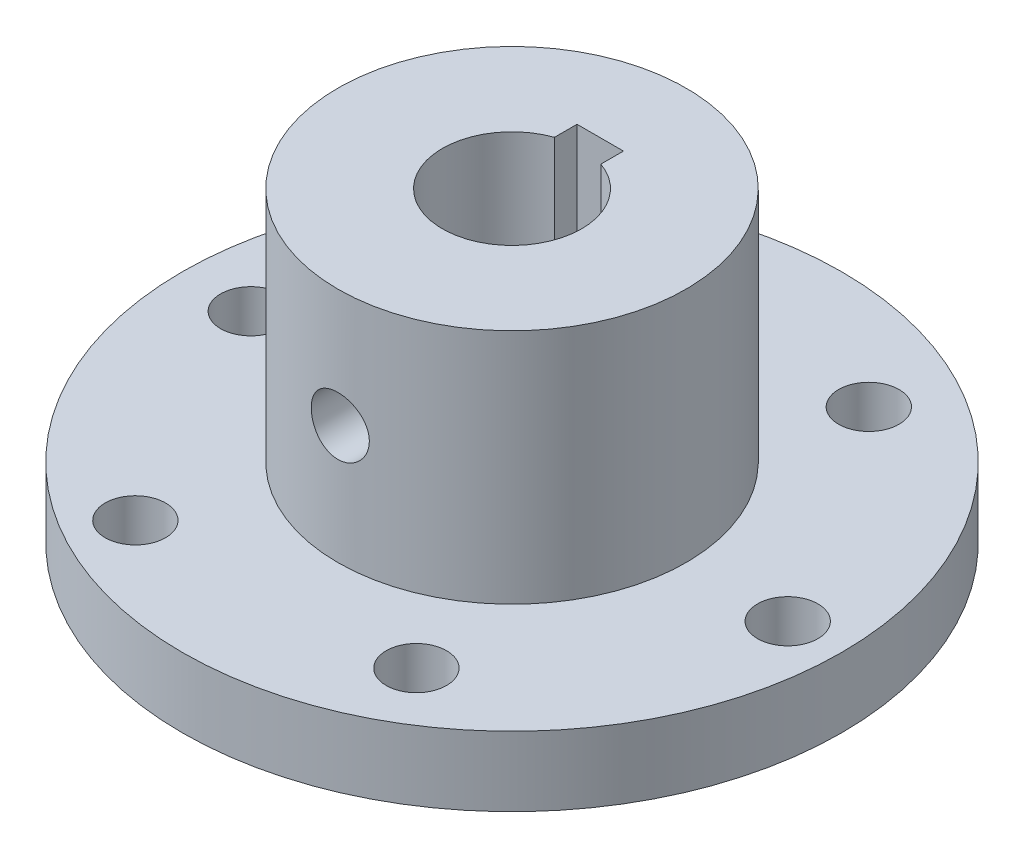
ISO-10303-21;
HEADER;
FILE_DESCRIPTION(('STEP AP214'),'2;1');
FILE_NAME('part.step','',(''),(''),'','','');
FILE_SCHEMA(('AUTOMOTIVE_DESIGN { 1 0 10303 214 1 1 1 1 }'));
ENDSEC;
DATA;
#1=APPLICATION_CONTEXT('core data for automotive mechanical design processes');
#2=APPLICATION_PROTOCOL_DEFINITION('international standard','automotive_design',2000,#1);
#3=PRODUCT_CONTEXT('',#1,'mechanical');
#4=PRODUCT('Part','Part','',(#3));
#5=PRODUCT_RELATED_PRODUCT_CATEGORY('part','',(#4));
#6=PRODUCT_DEFINITION_FORMATION('','',#4);
#7=PRODUCT_DEFINITION_CONTEXT('part definition',#1,'design');
#8=PRODUCT_DEFINITION('design','',#6,#7);
#9=PRODUCT_DEFINITION_SHAPE('','',#8);
#10=(LENGTH_UNIT() NAMED_UNIT(*) SI_UNIT(.MILLI.,.METRE.));
#11=(NAMED_UNIT(*) PLANE_ANGLE_UNIT() SI_UNIT($,.RADIAN.));
#12=(NAMED_UNIT(*) SI_UNIT($,.STERADIAN.) SOLID_ANGLE_UNIT());
#13=UNCERTAINTY_MEASURE_WITH_UNIT(LENGTH_MEASURE(1.E-05),#10,'distance_accuracy_value','');
#14=(GEOMETRIC_REPRESENTATION_CONTEXT(3) GLOBAL_UNCERTAINTY_ASSIGNED_CONTEXT((#13)) GLOBAL_UNIT_ASSIGNED_CONTEXT((#10,
#11,#12)) REPRESENTATION_CONTEXT('',''));
#15=CARTESIAN_POINT('',(0.,0.,0.));
#16=DIRECTION('',(0.,0.,1.));
#17=DIRECTION('',(1.,0.,0.));
#18=AXIS2_PLACEMENT_3D('',#15,#16,#17);
#19=CARTESIAN_POINT('',(0.,21.7671398618388,0.));
#20=DIRECTION('',(0.,1.,0.));
#21=DIRECTION('',(0.,0.,1.));
#22=AXIS2_PLACEMENT_3D('',#19,#20,#21);
#23=CYLINDRICAL_SURFACE('',#22,6.);
#24=CARTESIAN_POINT('',(2.49999999999999,16.2,5.45435605731786));
#25=CARTESIAN_POINT('',(2.4999985002592,16.2667081831549,5.45435734054166));
#26=CARTESIAN_POINT('',(2.49732449538892,16.3334347921685,5.4555854329));
#27=CARTESIAN_POINT('',(2.48666416485592,16.466386478403,5.460451257595));
#28=CARTESIAN_POINT('',(2.47867468210214,16.5326112338951,5.46409042196574));
#29=CARTESIAN_POINT('',(2.44679265931591,16.7300518667706,5.47848490817198));
#30=CARTESIAN_POINT('',(2.41498683408237,16.8598368164295,5.49271671920564));
#31=CARTESIAN_POINT('',(2.33180001337598,17.1111547641312,5.52853615769555));
#32=CARTESIAN_POINT('',(2.28049881438597,17.2327190520916,5.55009376241033));
#33=CARTESIAN_POINT('',(2.16001268934737,17.465510176557,5.59808356001864));
#34=CARTESIAN_POINT('',(2.09083199376536,17.5767394499768,5.62451459938574));
#35=CARTESIAN_POINT('',(1.93194778443699,17.7926539820894,5.68111508149861));
#36=CARTESIAN_POINT('',(1.84130648149063,17.8966157970475,5.71141131571832));
#37=CARTESIAN_POINT('',(1.64404334636732,18.0883997651745,5.77128595332676));
#38=CARTESIAN_POINT('',(1.53741538134828,18.1762156955111,5.80086407614999));
#39=CARTESIAN_POINT('',(1.30552678905513,18.3368992555286,5.8575107455344));
#40=CARTESIAN_POINT('',(1.17965858775786,18.4089533078815,5.88441479600861));
#41=CARTESIAN_POINT('',(0.916264044334339,18.5305519892175,5.93113040336416));
#42=CARTESIAN_POINT('',(0.778742909642265,18.5801066103974,5.95094510785638));
#43=CARTESIAN_POINT('',(0.503536996147009,18.6526789303404,5.98035041998161));
#44=CARTESIAN_POINT('',(0.366233152418011,18.6769433932332,5.99041942231785));
#45=CARTESIAN_POINT('',(0.0891583607041755,18.702275278892,6.00093657245546));
#46=CARTESIAN_POINT('',(-0.0506115635357642,18.7033521108742,6.00138862268061));
#47=CARTESIAN_POINT('',(-0.319585560218811,18.6829314389708,5.99290258260449));
#48=CARTESIAN_POINT('',(-0.44891497721289,18.6628037991731,5.98453429295767));
#49=CARTESIAN_POINT('',(-0.702165787864644,18.6028937944991,5.96013033502178));
#50=CARTESIAN_POINT('',(-0.826086782110444,18.5631099806788,5.94409410149731));
#51=CARTESIAN_POINT('',(-1.06727623615442,18.4645439182725,5.90559704827471));
#52=CARTESIAN_POINT('',(-1.18441435414908,18.4054810742758,5.88304194251414));
#53=CARTESIAN_POINT('',(-1.40742353456465,18.2703084865819,5.83371427980366));
#54=CARTESIAN_POINT('',(-1.51329059551623,18.1941927183021,5.80694023334947));
#55=CARTESIAN_POINT('',(-1.7186818234134,18.0208351591992,5.74963397551512));
#56=CARTESIAN_POINT('',(-1.81723287462318,17.922482417457,5.71896988702082));
#57=CARTESIAN_POINT('',(-1.99686282986463,17.7105771185719,5.65875721372882));
#58=CARTESIAN_POINT('',(-2.07793499168339,17.5970187233643,5.62920906299902));
#59=CARTESIAN_POINT('',(-2.22280378497074,17.3532099267203,5.57363224672088));
#60=CARTESIAN_POINT('',(-2.28594506698396,17.2225335886945,5.54775116967603));
#61=CARTESIAN_POINT('',(-2.38892864103959,16.9510379102374,5.50419688296718));
#62=CARTESIAN_POINT('',(-2.42878759251237,16.8102259035157,5.48651780631503));
#63=CARTESIAN_POINT('',(-2.48160050339177,16.532206382133,5.46282425074792));
#64=CARTESIAN_POINT('',(-2.49613229266516,16.3953577554715,5.45612738403682));
#65=CARTESIAN_POINT('',(-2.50251261037212,16.1210430351874,5.45320573611839));
#66=CARTESIAN_POINT('',(-2.49436898636094,15.9835771716193,5.45697733196185));
#67=CARTESIAN_POINT('',(-2.45706955131302,15.7212032291366,5.47386262693795));
#68=CARTESIAN_POINT('',(-2.42929237636147,15.5960546264258,5.48636276033852));
#69=CARTESIAN_POINT('',(-2.355341171284,15.3522974070049,5.51851260594277));
#70=CARTESIAN_POINT('',(-2.30916284106237,15.2336903263384,5.53816398920152));
#71=CARTESIAN_POINT('',(-2.19755041610386,15.0007693792872,5.58341595714177));
#72=CARTESIAN_POINT('',(-2.13138366612392,14.8868500507806,5.60923324404617));
#73=CARTESIAN_POINT('',(-1.98240156877197,14.6711838950007,5.66360007481535));
#74=CARTESIAN_POINT('',(-1.89957901575222,14.5694423665913,5.69215079841133));
#75=CARTESIAN_POINT('',(-1.71168891143074,14.3723997302374,5.75157239569101));
#76=CARTESIAN_POINT('',(-1.6053593229584,14.2782972001197,5.78244293417774));
#77=CARTESIAN_POINT('',(-1.37770302510815,14.1090554160204,5.84086722367755));
#78=CARTESIAN_POINT('',(-1.25637521761135,14.0339175517941,5.86842073153699));
#79=CARTESIAN_POINT('',(-1.00130936160272,13.9048202491916,5.91728503171628));
#80=CARTESIAN_POINT('',(-0.867540339261894,13.8509155177152,5.93857966278875));
#81=CARTESIAN_POINT('',(-0.591717670323945,13.7667664150372,5.9723634620551));
#82=CARTESIAN_POINT('',(-0.449669008506774,13.736507962451,5.98485787035281));
#83=CARTESIAN_POINT('',(-0.172033066960382,13.7022837499796,5.9990306959926));
#84=CARTESIAN_POINT('',(-0.036688169398434,13.69662800429,6.0014040908376));
#85=CARTESIAN_POINT('',(0.232973623239238,13.7072262789047,5.99699046946599));
#86=CARTESIAN_POINT('',(0.367290694377476,13.723476458314,5.99020505911644));
#87=CARTESIAN_POINT('',(0.626172965578195,13.7762121575427,5.96860132018429));
#88=CARTESIAN_POINT('',(0.750915078182083,13.8119594094758,5.9540764862017));
#89=CARTESIAN_POINT('',(0.992584458507235,13.9018684458724,5.91858999492374));
#90=CARTESIAN_POINT('',(1.1095102366691,13.9560337283582,5.89762711496349));
#91=CARTESIAN_POINT('',(1.33804914068053,14.0839792475792,5.85011651583377));
#92=CARTESIAN_POINT('',(1.44918335299798,14.1585353235131,5.82335921372399));
#93=CARTESIAN_POINT('',(1.65783731421916,14.3240136448107,5.7674312075248));
#94=CARTESIAN_POINT('',(1.75535198504112,14.4149419658361,5.73825960968076));
#95=CARTESIAN_POINT('',(1.94089972242289,14.6178925300721,5.67829702479813));
#96=CARTESIAN_POINT('',(2.02783607699355,14.73092911203,5.64753091772368));
#97=CARTESIAN_POINT('',(2.18166607575475,14.9709063920007,5.5899105903639));
#98=CARTESIAN_POINT('',(2.24854851583745,15.0978548086674,5.56305856115973));
#99=CARTESIAN_POINT('',(2.35965744264202,15.3619289333595,5.51685287460303));
#100=CARTESIAN_POINT('',(2.40400437258695,15.4989959551496,5.49745949216625));
#101=CARTESIAN_POINT('',(2.45239925350777,15.7091637690664,5.47594959049764));
#102=CARTESIAN_POINT('',(2.46550603347807,15.779910597956,5.47004503557757));
#103=CARTESIAN_POINT('',(2.48558130943927,15.9224260564186,5.46095373466209));
#104=CARTESIAN_POINT('',(2.49255414024396,15.9941939279226,5.45776506941946));
#105=CARTESIAN_POINT('',(2.49880479670822,16.110711605639,5.45490391727668));
#106=CARTESIAN_POINT('',(2.50000100378858,16.1553516756734,5.45435519844583));
#107=CARTESIAN_POINT('',(2.49999999999999,16.2,5.45435605731786));
#108=B_SPLINE_CURVE_WITH_KNOTS('',3,(#24,#25,#26,#27,#28,#29,#30,#31,#32,#33,#34,#35,#36,#37,
#38,#39,#40,#41,#42,#43,#44,#45,#46,#47,#48,#49,#50,#51,#52,#53,#54,#55,#56,#57,#58,#59,#60,#61,
#62,#63,#64,#65,#66,#67,#68,#69,#70,#71,#72,#73,#74,#75,#76,#77,#78,#79,#80,#81,#82,#83,#84,#85,
#86,#87,#88,#89,#90,#91,#92,#93,#94,#95,#96,#97,#98,#99,#100,#101,#102,#103,#104,#105,#106,
#107),.UNSPECIFIED.,.T.,.F.,(4,2,2,2,2,2,2,2,2,2,2,2,2,2,2,2,2,2,2,2,2,2,2,2,2,2,2,2,2,2,2,2,2,
2,2,2,2,2,2,2,2,4),(0.,0.200084575093045,0.400288095243579,0.8012789949569,1.20064597557677,
1.59991854837274,2.02172149988562,2.44368668047075,2.88395420283102,3.32402600677036,
3.74119679083158,4.15819828963115,4.5498214761744,4.94147353531021,5.33910096407385,
5.73686909172222,6.16267530816222,6.58864548009986,7.02861558463917,7.46827048625632,
7.87940023747109,8.29038772171391,8.67506269266877,9.05982760961553,9.46088720770831,
9.86212068725424,10.2960179260552,10.7299469521823,11.1649867904568,11.5997673642051,
12.004157373226,12.4084764873832,12.7984529720747,13.1885035639884,13.5961819279257,
14.004011892323,14.4395932095167,14.8754174341574,15.3088871873109,15.5252058174741,
15.7413714538654,15.8752896716762),.UNSPECIFIED.);
#109=CARTESIAN_POINT('',(2.49999999999999,16.2,5.45435605731786));
#110=VERTEX_POINT('',#109);
#111=EDGE_CURVE('E189',#110,#110,#108,.T.);
#112=ORIENTED_EDGE('',*,*,#111,.T.);
#113=EDGE_LOOP('',(#112));
#114=FACE_BOUND('',#113,.T.);
#115=CARTESIAN_POINT('',(0.,0.,0.));
#116=DIRECTION('',(0.,1.,0.));
#117=DIRECTION('',(0.,0.,1.));
#118=AXIS2_PLACEMENT_3D('',#115,#116,#117);
#119=CIRCLE('',#118,6.);
#120=CARTESIAN_POINT('',(-2.,0.,-5.65685424949238));
#121=VERTEX_POINT('',#120);
#122=CARTESIAN_POINT('',(2.,0.,-5.65685424949238));
#123=VERTEX_POINT('',#122);
#124=EDGE_CURVE('E11',#121,#123,#119,.T.);
#125=ORIENTED_EDGE('',*,*,#124,.F.);
#126=DIRECTION('',(0.,1.,0.));
#127=VECTOR('',#126,1.);
#128=CARTESIAN_POINT('',(-2.,-0.001000000000001,-5.65685424949238));
#129=LINE('',#128,#127);
#130=CARTESIAN_POINT('',(-2.,26.4,-5.65685424949238));
#131=VERTEX_POINT('',#130);
#132=EDGE_CURVE('E60',#121,#131,#129,.T.);
#133=ORIENTED_EDGE('',*,*,#132,.T.);
#134=CARTESIAN_POINT('',(0.,26.4,0.));
#135=DIRECTION('',(0.,1.,0.));
#136=DIRECTION('',(0.,0.,1.));
#137=AXIS2_PLACEMENT_3D('',#134,#135,#136);
#138=CIRCLE('',#137,6.);
#139=CARTESIAN_POINT('',(2.,26.4,-5.65685424949238));
#140=VERTEX_POINT('',#139);
#141=EDGE_CURVE('E90',#131,#140,#138,.T.);
#142=ORIENTED_EDGE('',*,*,#141,.T.);
#143=DIRECTION('',(0.,1.,0.));
#144=VECTOR('',#143,1.);
#145=CARTESIAN_POINT('',(2.,-0.001000000000001,-5.65685424949238));
#146=LINE('',#145,#144);
#147=EDGE_CURVE('E52',#123,#140,#146,.T.);
#148=ORIENTED_EDGE('',*,*,#147,.F.);
#149=EDGE_LOOP('',(#125,#133,#142,#148));
#150=FACE_BOUND('',#149,.T.);
#151=ADVANCED_FACE('F38',(#114,#150),#23,.F.);
#152=CARTESIAN_POINT('',(0.,0.,-6.));
#153=DIRECTION('',(0.,1.,0.));
#154=DIRECTION('',(0.,0.,1.));
#155=AXIS2_PLACEMENT_3D('',#152,#153,#154);
#156=PLANE('',#155);
#157=CARTESIAN_POINT('',(-22.5,0.,0.));
#158=DIRECTION('',(0.,1.,0.));
#159=DIRECTION('',(0.,0.,1.));
#160=AXIS2_PLACEMENT_3D('',#157,#158,#159);
#161=CIRCLE('',#160,2.6);
#162=CARTESIAN_POINT('',(-22.5,0.,2.6));
#163=VERTEX_POINT('',#162);
#164=EDGE_CURVE('E114',#163,#163,#161,.F.);
#165=ORIENTED_EDGE('',*,*,#164,.F.);
#166=EDGE_LOOP('',(#165));
#167=FACE_BOUND('',#166,.T.);
#168=CARTESIAN_POINT('',(-11.8749999999998,0.,-20.5681033398805));
#169=DIRECTION('',(0.,1.,0.));
#170=DIRECTION('',(0.,0.,1.));
#171=AXIS2_PLACEMENT_3D('',#168,#169,#170);
#172=CIRCLE('',#171,2.6);
#173=CARTESIAN_POINT('',(-11.8749999999998,0.,-17.9681033398805));
#174=VERTEX_POINT('',#173);
#175=EDGE_CURVE('E120',#174,#174,#172,.F.);
#176=ORIENTED_EDGE('',*,*,#175,.F.);
#177=EDGE_LOOP('',(#176));
#178=FACE_BOUND('',#177,.T.);
#179=CARTESIAN_POINT('',(-11.8750000000001,0.,20.5681033398804));
#180=DIRECTION('',(0.,1.,0.));
#181=DIRECTION('',(0.,0.,1.));
#182=AXIS2_PLACEMENT_3D('',#179,#180,#181);
#183=CIRCLE('',#182,2.6);
#184=CARTESIAN_POINT('',(-11.8750000000001,0.,23.1681033398804));
#185=VERTEX_POINT('',#184);
#186=EDGE_CURVE('E139',#185,#185,#183,.F.);
#187=ORIENTED_EDGE('',*,*,#186,.F.);
#188=EDGE_LOOP('',(#187));
#189=FACE_BOUND('',#188,.T.);
#190=CARTESIAN_POINT('',(11.2499999999998,0.,19.48557158515));
#191=DIRECTION('',(0.,1.,0.));
#192=DIRECTION('',(0.,0.,1.));
#193=AXIS2_PLACEMENT_3D('',#190,#191,#192);
#194=CIRCLE('',#193,2.6);
#195=CARTESIAN_POINT('',(11.2499999999998,0.,22.08557158515));
#196=VERTEX_POINT('',#195);
#197=EDGE_CURVE('E133',#196,#196,#194,.F.);
#198=ORIENTED_EDGE('',*,*,#197,.F.);
#199=EDGE_LOOP('',(#198));
#200=FACE_BOUND('',#199,.T.);
#201=CARTESIAN_POINT('',(11.2500000000001,0.,-19.4855715851498));
#202=DIRECTION('',(0.,1.,0.));
#203=DIRECTION('',(0.,0.,1.));
#204=AXIS2_PLACEMENT_3D('',#201,#202,#203);
#205=CIRCLE('',#204,2.6);
#206=CARTESIAN_POINT('',(11.2500000000001,0.,-16.8855715851498));
#207=VERTEX_POINT('',#206);
#208=EDGE_CURVE('E127',#207,#207,#205,.F.);
#209=ORIENTED_EDGE('',*,*,#208,.F.);
#210=EDGE_LOOP('',(#209));
#211=FACE_BOUND('',#210,.T.);
#212=CARTESIAN_POINT('',(23.75,0.,0.));
#213=DIRECTION('',(0.,1.,0.));
#214=DIRECTION('',(0.,0.,1.));
#215=AXIS2_PLACEMENT_3D('',#212,#213,#214);
#216=CIRCLE('',#215,2.6);
#217=CARTESIAN_POINT('',(23.75,0.,2.6));
#218=VERTEX_POINT('',#217);
#219=EDGE_CURVE('E115',#218,#218,#216,.F.);
#220=ORIENTED_EDGE('',*,*,#219,.F.);
#221=EDGE_LOOP('',(#220));
#222=FACE_BOUND('',#221,.T.);
#223=CARTESIAN_POINT('',(0.,0.,0.));
#224=DIRECTION('',(0.,1.,0.));
#225=DIRECTION('',(0.,0.,1.));
#226=AXIS2_PLACEMENT_3D('',#223,#224,#225);
#227=CIRCLE('',#226,28.4);
#228=CARTESIAN_POINT('',(0.,0.,28.4));
#229=VERTEX_POINT('',#228);
#230=EDGE_CURVE('E45',#229,#229,#227,.T.);
#231=ORIENTED_EDGE('',*,*,#230,.F.);
#232=EDGE_LOOP('',(#231));
#233=FACE_BOUND('',#232,.T.);
#234=DIRECTION('',(1.,0.,0.));
#235=VECTOR('',#234,1.);
#236=CARTESIAN_POINT('',(-2.,0.,-7.6));
#237=LINE('',#236,#235);
#238=CARTESIAN_POINT('',(-2.,0.,-7.6));
#239=VERTEX_POINT('',#238);
#240=CARTESIAN_POINT('',(2.,0.,-7.6));
#241=VERTEX_POINT('',#240);
#242=EDGE_CURVE('E95',#239,#241,#237,.T.);
#243=ORIENTED_EDGE('',*,*,#242,.F.);
#244=DIRECTION('',(0.,0.,-1.));
#245=VECTOR('',#244,1.);
#246=CARTESIAN_POINT('',(-2.,0.,-7.6));
#247=LINE('',#246,#245);
#248=EDGE_CURVE('E94',#121,#239,#247,.T.);
#249=ORIENTED_EDGE('',*,*,#248,.F.);
#250=ORIENTED_EDGE('',*,*,#124,.T.);
#251=DIRECTION('',(0.,0.,1.));
#252=VECTOR('',#251,1.);
#253=CARTESIAN_POINT('',(2.,0.,-7.6));
#254=LINE('',#253,#252);
#255=EDGE_CURVE('E78',#241,#123,#254,.T.);
#256=ORIENTED_EDGE('',*,*,#255,.F.);
#257=EDGE_LOOP('',(#243,#249,#250,#256));
#258=FACE_BOUND('',#257,.T.);
#259=ADVANCED_FACE('F93',(#167,#178,#189,#200,#211,#222,#233,#258),#156,.F.);
#260=CARTESIAN_POINT('',(0.,21.7671398618388,0.));
#261=DIRECTION('',(0.,1.,0.));
#262=DIRECTION('',(0.,0.,1.));
#263=AXIS2_PLACEMENT_3D('',#260,#261,#262);
#264=CYLINDRICAL_SURFACE('',#263,28.4);
#265=CARTESIAN_POINT('',(0.,6.,0.));
#266=DIRECTION('',(0.,1.,0.));
#267=DIRECTION('',(0.,0.,1.));
#268=AXIS2_PLACEMENT_3D('',#265,#266,#267);
#269=CIRCLE('',#268,28.4);
#270=CARTESIAN_POINT('',(0.,6.,28.4));
#271=VERTEX_POINT('',#270);
#272=EDGE_CURVE('E153',#271,#271,#269,.T.);
#273=ORIENTED_EDGE('',*,*,#272,.F.);
#274=EDGE_LOOP('',(#273));
#275=FACE_BOUND('',#274,.T.);
#276=ORIENTED_EDGE('',*,*,#230,.T.);
#277=EDGE_LOOP('',(#276));
#278=FACE_BOUND('',#277,.T.);
#279=ADVANCED_FACE('F158',(#275,#278),#264,.T.);
#280=CARTESIAN_POINT('',(0.,6.,-28.4));
#281=DIRECTION('',(0.,-1.,0.));
#282=DIRECTION('',(0.,0.,-1.));
#283=AXIS2_PLACEMENT_3D('',#280,#281,#282);
#284=PLANE('',#283);
#285=CARTESIAN_POINT('',(-22.5,6.,0.));
#286=DIRECTION('',(0.,1.,0.));
#287=DIRECTION('',(0.,0.,1.));
#288=AXIS2_PLACEMENT_3D('',#285,#286,#287);
#289=CIRCLE('',#288,2.6);
#290=CARTESIAN_POINT('',(-22.5,6.,2.6));
#291=VERTEX_POINT('',#290);
#292=EDGE_CURVE('E111',#291,#291,#289,.T.);
#293=ORIENTED_EDGE('',*,*,#292,.F.);
#294=EDGE_LOOP('',(#293));
#295=FACE_BOUND('',#294,.T.);
#296=CARTESIAN_POINT('',(-11.8749999999998,6.,-20.5681033398805));
#297=DIRECTION('',(0.,1.,0.));
#298=DIRECTION('',(0.,0.,1.));
#299=AXIS2_PLACEMENT_3D('',#296,#297,#298);
#300=CIRCLE('',#299,2.6);
#301=CARTESIAN_POINT('',(-11.8749999999998,6.,-17.9681033398805));
#302=VERTEX_POINT('',#301);
#303=EDGE_CURVE('E84',#302,#302,#300,.T.);
#304=ORIENTED_EDGE('',*,*,#303,.F.);
#305=EDGE_LOOP('',(#304));
#306=FACE_BOUND('',#305,.T.);
#307=CARTESIAN_POINT('',(-11.8750000000001,6.,20.5681033398804));
#308=DIRECTION('',(0.,1.,0.));
#309=DIRECTION('',(0.,0.,1.));
#310=AXIS2_PLACEMENT_3D('',#307,#308,#309);
#311=CIRCLE('',#310,2.6);
#312=CARTESIAN_POINT('',(-11.8750000000001,6.,23.1681033398804));
#313=VERTEX_POINT('',#312);
#314=EDGE_CURVE('E123',#313,#313,#311,.T.);
#315=ORIENTED_EDGE('',*,*,#314,.F.);
#316=EDGE_LOOP('',(#315));
#317=FACE_BOUND('',#316,.T.);
#318=CARTESIAN_POINT('',(11.2499999999998,6.,19.48557158515));
#319=DIRECTION('',(0.,1.,0.));
#320=DIRECTION('',(0.,0.,1.));
#321=AXIS2_PLACEMENT_3D('',#318,#319,#320);
#322=CIRCLE('',#321,2.6);
#323=CARTESIAN_POINT('',(11.2499999999998,6.,22.08557158515));
#324=VERTEX_POINT('',#323);
#325=EDGE_CURVE('E136',#324,#324,#322,.T.);
#326=ORIENTED_EDGE('',*,*,#325,.F.);
#327=EDGE_LOOP('',(#326));
#328=FACE_BOUND('',#327,.T.);
#329=CARTESIAN_POINT('',(11.2500000000001,6.,-19.4855715851498));
#330=DIRECTION('',(0.,1.,0.));
#331=DIRECTION('',(0.,0.,1.));
#332=AXIS2_PLACEMENT_3D('',#329,#330,#331);
#333=CIRCLE('',#332,2.6);
#334=CARTESIAN_POINT('',(11.2500000000001,6.,-16.8855715851498));
#335=VERTEX_POINT('',#334);
#336=EDGE_CURVE('E130',#335,#335,#333,.T.);
#337=ORIENTED_EDGE('',*,*,#336,.F.);
#338=EDGE_LOOP('',(#337));
#339=FACE_BOUND('',#338,.T.);
#340=CARTESIAN_POINT('',(23.75,6.,0.));
#341=DIRECTION('',(0.,1.,0.));
#342=DIRECTION('',(0.,0.,1.));
#343=AXIS2_PLACEMENT_3D('',#340,#341,#342);
#344=CIRCLE('',#343,2.6);
#345=CARTESIAN_POINT('',(23.75,6.,2.6));
#346=VERTEX_POINT('',#345);
#347=EDGE_CURVE('E124',#346,#346,#344,.T.);
#348=ORIENTED_EDGE('',*,*,#347,.F.);
#349=EDGE_LOOP('',(#348));
#350=FACE_BOUND('',#349,.T.);
#351=CARTESIAN_POINT('',(0.,6.,0.));
#352=DIRECTION('',(0.,1.,0.));
#353=DIRECTION('',(0.,0.,1.));
#354=AXIS2_PLACEMENT_3D('',#351,#352,#353);
#355=CIRCLE('',#354,15.);
#356=CARTESIAN_POINT('',(0.,6.,15.));
#357=VERTEX_POINT('',#356);
#358=EDGE_CURVE('E150',#357,#357,#355,.T.);
#359=ORIENTED_EDGE('',*,*,#358,.F.);
#360=EDGE_LOOP('',(#359));
#361=FACE_BOUND('',#360,.T.);
#362=ORIENTED_EDGE('',*,*,#272,.T.);
#363=EDGE_LOOP('',(#362));
#364=FACE_BOUND('',#363,.T.);
#365=ADVANCED_FACE('F166',(#295,#306,#317,#328,#339,#350,#361,#364),#284,.F.);
#366=CARTESIAN_POINT('',(0.,21.7671398618388,0.));
#367=DIRECTION('',(0.,1.,0.));
#368=DIRECTION('',(0.,0.,1.));
#369=AXIS2_PLACEMENT_3D('',#366,#367,#368);
#370=CYLINDRICAL_SURFACE('',#369,15.);
#371=CARTESIAN_POINT('',(0.,13.7,15.));
#372=CARTESIAN_POINT('',(-0.139390904958214,13.7000055889478,14.9999976116882));
#373=CARTESIAN_POINT('',(-0.27885788183882,13.7116972749689,14.9980367791303));
#374=CARTESIAN_POINT('',(-0.553880221673041,13.7581356587653,14.9904034494139));
#375=CARTESIAN_POINT('',(-0.689431867959245,13.7929035569116,14.9847275392389));
#376=CARTESIAN_POINT('',(-0.952604747212641,13.8844154485928,14.9703006823645));
#377=CARTESIAN_POINT('',(-1.0802323684319,13.9411414656406,14.9615522515919));
#378=CARTESIAN_POINT('',(-1.32414184197794,14.0749122920524,14.9419422708207));
#379=CARTESIAN_POINT('',(-1.44042498987859,14.151954777483,14.9310809625443));
#380=CARTESIAN_POINT('',(-1.65947261429167,14.3249550838205,14.9083331745831));
#381=CARTESIAN_POINT('',(-1.76211290353496,14.4210691146361,14.8964387181486));
#382=CARTESIAN_POINT('',(-1.94988849865992,14.6291479684728,14.8730262687673));
#383=CARTESIAN_POINT('',(-2.03502269939097,14.7411137914566,14.8615082996267));
#384=CARTESIAN_POINT('',(-2.18586712560513,14.9785709661971,14.8400756575978));
#385=CARTESIAN_POINT('',(-2.251454552861,15.1041413368048,14.8301712909164));
#386=CARTESIAN_POINT('',(-2.36055836541121,15.3647095643006,14.8131978979467));
#387=CARTESIAN_POINT('',(-2.40407624156561,15.4997067836776,14.8061286801431));
#388=CARTESIAN_POINT('',(-2.4674143777848,15.7739802748565,14.7957053684276));
#389=CARTESIAN_POINT('',(-2.48744902913539,15.9132057365014,14.792317684857));
#390=CARTESIAN_POINT('',(-2.50391672528987,16.1930802768835,14.7895393893665));
#391=CARTESIAN_POINT('',(-2.50035144038899,16.3337292541673,14.7901484945721));
#392=CARTESIAN_POINT('',(-2.46989509839614,16.6109278612754,14.7952642886356));
#393=CARTESIAN_POINT('',(-2.44324488188977,16.7475048035452,14.7997307331892));
#394=CARTESIAN_POINT('',(-2.36775314040344,17.0142213178291,14.8119949521101));
#395=CARTESIAN_POINT('',(-2.31891085431973,17.1443606688885,14.8197928407327));
#396=CARTESIAN_POINT('',(-2.20017724609391,17.3952288234409,14.837884793341));
#397=CARTESIAN_POINT('',(-2.13018591387971,17.5159094060812,14.8481906710733));
#398=CARTESIAN_POINT('',(-1.97121201755743,17.7439044005384,14.8701291841501));
#399=CARTESIAN_POINT('',(-1.88222792065428,17.8512177324549,14.8817619265429));
#400=CARTESIAN_POINT('',(-1.68648221215905,18.0508260858073,14.9052202787979));
#401=CARTESIAN_POINT('',(-1.57951396387312,18.1429185185401,14.9170464923165));
#402=CARTESIAN_POINT('',(-1.35153524898164,18.3078777626653,14.9394260139672));
#403=CARTESIAN_POINT('',(-1.23052469190642,18.3807444501832,14.9499793138975));
#404=CARTESIAN_POINT('',(-0.977705916166708,18.5052022271363,14.9686389289291));
#405=CARTESIAN_POINT('',(-0.845888725564658,18.5567754193312,14.9767431840745));
#406=CARTESIAN_POINT('',(-0.575298345602729,18.636994215246,14.9895750301266));
#407=CARTESIAN_POINT('',(-0.436525739179466,18.6656417369737,14.9943029035047));
#408=CARTESIAN_POINT('',(-0.157709901301622,18.6989213584611,14.9998112984269));
#409=CARTESIAN_POINT('',(-0.0177007371510106,18.7038315718056,15.0006375301278));
#410=CARTESIAN_POINT('',(0.261139772889887,18.6902386555719,14.9983747442117));
#411=CARTESIAN_POINT('',(0.399971163892038,18.6717364268663,14.9952858772412));
#412=CARTESIAN_POINT('',(0.671656175546762,18.6120751506645,14.985568269382));
#413=CARTESIAN_POINT('',(0.804540868385378,18.5710537916099,14.9789610480131));
#414=CARTESIAN_POINT('',(1.06154688486044,18.4676654818005,14.9629446445536));
#415=CARTESIAN_POINT('',(1.18566771590972,18.4052973323647,14.9535353051202));
#416=CARTESIAN_POINT('',(1.42283068946895,18.2603488753032,14.9328451630241));
#417=CARTESIAN_POINT('',(1.53576525093714,18.1775948438327,14.9215485588702));
#418=CARTESIAN_POINT('',(1.74624358550268,17.9944626846149,14.898384673919));
#419=CARTESIAN_POINT('',(1.84378623969658,17.8940832767233,14.8865173517155));
#420=CARTESIAN_POINT('',(2.02174277965799,17.6773024519286,14.8634017523585));
#421=CARTESIAN_POINT('',(2.10196876111371,17.5607458344856,14.8521611613711));
#422=CARTESIAN_POINT('',(2.24170231029498,17.3156470308615,14.8317152977788));
#423=CARTESIAN_POINT('',(2.30121053476982,17.1871052247725,14.8225099606602));
#424=CARTESIAN_POINT('',(2.39753833147314,16.9222102671879,14.807234536977));
#425=CARTESIAN_POINT('',(2.43445143254794,16.7858919049695,14.8011515431106));
#426=CARTESIAN_POINT('',(2.48483545377827,16.5088798707782,14.7927771683526));
#427=CARTESIAN_POINT('',(2.49830841194616,16.3681865802679,14.7904854578272));
#428=CARTESIAN_POINT('',(2.50137286604735,16.0882948340376,14.7899673308401));
#429=CARTESIAN_POINT('',(2.49126013612518,15.9490996214247,14.7916905650565));
#430=CARTESIAN_POINT('',(2.44807983895684,15.6744207519492,14.7988978145373));
#431=CARTESIAN_POINT('',(2.41501234611247,15.5389370830581,14.8043818176121));
#432=CARTESIAN_POINT('',(2.32697448959489,15.2756415627074,14.8184735628172));
#433=CARTESIAN_POINT('',(2.27202959060044,15.147820989944,14.8270776721967));
#434=CARTESIAN_POINT('',(2.1418270039159,14.9031643308052,14.8464436892221));
#435=CARTESIAN_POINT('',(2.06656830874856,14.7863287896279,14.857205703884));
#436=CARTESIAN_POINT('',(1.89681888437215,14.5654644168923,14.8798345404562));
#437=CARTESIAN_POINT('',(1.80211056359364,14.4616039832997,14.891712955763));
#438=CARTESIAN_POINT('',(1.59660903138023,14.2711483955251,14.9151437236084));
#439=CARTESIAN_POINT('',(1.48581211291263,14.1845572313618,14.9266960002655));
#440=CARTESIAN_POINT('',(1.25036916964028,14.0305517318001,14.9482652964222));
#441=CARTESIAN_POINT('',(1.12563278753281,13.9632739606871,14.958271162531));
#442=CARTESIAN_POINT('',(0.866513069378979,13.8507305153901,14.9755116760178));
#443=CARTESIAN_POINT('',(0.732139494830008,13.8054429189203,14.9827490817748));
#444=CARTESIAN_POINT('',(0.497703310045399,13.7479947258733,14.9920579083296));
#445=CARTESIAN_POINT('',(0.399058830298446,13.730025530384,14.9950202727336));
#446=CARTESIAN_POINT('',(0.200289310319809,13.7060262621553,14.9989921598612));
#447=CARTESIAN_POINT('',(0.100164295608494,13.6999959838626,15.0000017162064));
#448=CARTESIAN_POINT('',(0.,13.7,15.));
#449=B_SPLINE_CURVE_WITH_KNOTS('',3,(#371,#372,#373,#374,#375,#376,#377,#378,#379,#380,#381,
#382,#383,#384,#385,#386,#387,#388,#389,#390,#391,#392,#393,#394,#395,#396,#397,#398,#399,#400,
#401,#402,#403,#404,#405,#406,#407,#408,#409,#410,#411,#412,#413,#414,#415,#416,#417,#418,#419,
#420,#421,#422,#423,#424,#425,#426,#427,#428,#429,#430,#431,#432,#433,#434,#435,#436,#437,#438,
#439,#440,#441,#442,#443,#444,#445,#446,#447,#448),.UNSPECIFIED.,.T.,.F.,(4,2,2,2,2,2,2,2,2,2,2,
2,2,2,2,2,2,2,2,2,2,2,2,2,2,2,2,2,2,2,2,2,2,2,2,2,2,2,4),(0.,0.417806584938508,
0.835997545695418,1.25384686702527,1.67164841267479,2.09302491062331,2.51442800169856,
2.93842520823839,3.3623937687618,3.78246077103423,4.20249804320885,4.61820521760407,
5.0339266502538,5.45164556632556,5.86939820680572,6.29232769911325,6.71525991635846,
7.13854688915901,7.56179844521147,7.98007883491395,8.39834313035857,8.81407807006413,
9.22983635826064,9.64926825627021,10.0687306305428,10.4925382200762,10.9163323737594,
11.3383602234177,11.7603513778661,12.177079095227,12.5938054618813,13.0100481822622,
13.4263115502933,13.8475138419339,14.2688133387897,14.693022316072,15.1168075213007,
15.4170424816401,15.7172722727696),.UNSPECIFIED.);
#450=CARTESIAN_POINT('',(0.,13.7,15.));
#451=VERTEX_POINT('',#450);
#452=EDGE_CURVE('E100',#451,#451,#449,.T.);
#453=ORIENTED_EDGE('',*,*,#452,.T.);
#454=EDGE_LOOP('',(#453));
#455=FACE_BOUND('',#454,.T.);
#456=CARTESIAN_POINT('',(0.,26.4,0.));
#457=DIRECTION('',(0.,1.,0.));
#458=DIRECTION('',(0.,0.,1.));
#459=AXIS2_PLACEMENT_3D('',#456,#457,#458);
#460=CIRCLE('',#459,15.);
#461=CARTESIAN_POINT('',(0.,26.4,15.));
#462=VERTEX_POINT('',#461);
#463=EDGE_CURVE('E147',#462,#462,#460,.T.);
#464=ORIENTED_EDGE('',*,*,#463,.F.);
#465=EDGE_LOOP('',(#464));
#466=FACE_BOUND('',#465,.T.);
#467=ORIENTED_EDGE('',*,*,#358,.T.);
#468=EDGE_LOOP('',(#467));
#469=FACE_BOUND('',#468,.T.);
#470=ADVANCED_FACE('F175',(#455,#466,#469),#370,.T.);
#471=CARTESIAN_POINT('',(0.,26.4,-15.));
#472=DIRECTION('',(0.,-1.,0.));
#473=DIRECTION('',(0.,0.,-1.));
#474=AXIS2_PLACEMENT_3D('',#471,#472,#473);
#475=PLANE('',#474);
#476=ORIENTED_EDGE('',*,*,#141,.F.);
#477=DIRECTION('',(0.,0.,1.));
#478=VECTOR('',#477,1.);
#479=CARTESIAN_POINT('',(-2.,26.4,-7.6));
#480=LINE('',#479,#478);
#481=CARTESIAN_POINT('',(-2.,26.4,-7.6));
#482=VERTEX_POINT('',#481);
#483=EDGE_CURVE('E91',#482,#131,#480,.T.);
#484=ORIENTED_EDGE('',*,*,#483,.F.);
#485=DIRECTION('',(-1.,0.,0.));
#486=VECTOR('',#485,1.);
#487=CARTESIAN_POINT('',(-2.,26.4,-7.6));
#488=LINE('',#487,#486);
#489=CARTESIAN_POINT('',(2.,26.4,-7.6));
#490=VERTEX_POINT('',#489);
#491=EDGE_CURVE('E98',#490,#482,#488,.T.);
#492=ORIENTED_EDGE('',*,*,#491,.F.);
#493=DIRECTION('',(0.,0.,-1.));
#494=VECTOR('',#493,1.);
#495=CARTESIAN_POINT('',(2.,26.4,-7.6));
#496=LINE('',#495,#494);
#497=EDGE_CURVE('E96',#140,#490,#496,.T.);
#498=ORIENTED_EDGE('',*,*,#497,.F.);
#499=EDGE_LOOP('',(#476,#484,#492,#498));
#500=FACE_BOUND('',#499,.T.);
#501=ORIENTED_EDGE('',*,*,#463,.T.);
#502=EDGE_LOOP('',(#501));
#503=FACE_BOUND('',#502,.T.);
#504=ADVANCED_FACE('F180',(#500,#503),#475,.F.);
#505=CARTESIAN_POINT('',(23.75,-0.00100000000000013,0.));
#506=DIRECTION('',(0.,1.,0.));
#507=DIRECTION('',(0.,0.,1.));
#508=AXIS2_PLACEMENT_3D('',#505,#506,#507);
#509=CYLINDRICAL_SURFACE('',#508,2.6);
#510=ORIENTED_EDGE('',*,*,#347,.T.);
#511=EDGE_LOOP('',(#510));
#512=FACE_BOUND('',#511,.T.);
#513=ORIENTED_EDGE('',*,*,#219,.T.);
#514=EDGE_LOOP('',(#513));
#515=FACE_BOUND('',#514,.T.);
#516=ADVANCED_FACE('F219',(#512,#515),#509,.F.);
#517=CARTESIAN_POINT('',(11.2500000000001,-0.00100000000000013,-19.4855715851498));
#518=DIRECTION('',(0.,1.,0.));
#519=DIRECTION('',(0.,0.,1.));
#520=AXIS2_PLACEMENT_3D('',#517,#518,#519);
#521=CYLINDRICAL_SURFACE('',#520,2.6);
#522=ORIENTED_EDGE('',*,*,#336,.T.);
#523=EDGE_LOOP('',(#522));
#524=FACE_BOUND('',#523,.T.);
#525=ORIENTED_EDGE('',*,*,#208,.T.);
#526=EDGE_LOOP('',(#525));
#527=FACE_BOUND('',#526,.T.);
#528=ADVANCED_FACE('F222',(#524,#527),#521,.F.);
#529=CARTESIAN_POINT('',(11.2499999999998,-0.00100000000000013,19.48557158515));
#530=DIRECTION('',(0.,1.,0.));
#531=DIRECTION('',(0.,0.,1.));
#532=AXIS2_PLACEMENT_3D('',#529,#530,#531);
#533=CYLINDRICAL_SURFACE('',#532,2.6);
#534=ORIENTED_EDGE('',*,*,#325,.T.);
#535=EDGE_LOOP('',(#534));
#536=FACE_BOUND('',#535,.T.);
#537=ORIENTED_EDGE('',*,*,#197,.T.);
#538=EDGE_LOOP('',(#537));
#539=FACE_BOUND('',#538,.T.);
#540=ADVANCED_FACE('F226',(#536,#539),#533,.F.);
#541=CARTESIAN_POINT('',(-11.8750000000001,-0.00100000000000013,20.5681033398804));
#542=DIRECTION('',(0.,1.,0.));
#543=DIRECTION('',(0.,0.,1.));
#544=AXIS2_PLACEMENT_3D('',#541,#542,#543);
#545=CYLINDRICAL_SURFACE('',#544,2.6);
#546=ORIENTED_EDGE('',*,*,#314,.T.);
#547=EDGE_LOOP('',(#546));
#548=FACE_BOUND('',#547,.T.);
#549=ORIENTED_EDGE('',*,*,#186,.T.);
#550=EDGE_LOOP('',(#549));
#551=FACE_BOUND('',#550,.T.);
#552=ADVANCED_FACE('F217',(#548,#551),#545,.F.);
#553=CARTESIAN_POINT('',(-11.8749999999998,-0.00100000000000013,-20.5681033398805));
#554=DIRECTION('',(0.,1.,0.));
#555=DIRECTION('',(0.,0.,1.));
#556=AXIS2_PLACEMENT_3D('',#553,#554,#555);
#557=CYLINDRICAL_SURFACE('',#556,2.6);
#558=ORIENTED_EDGE('',*,*,#303,.T.);
#559=EDGE_LOOP('',(#558));
#560=FACE_BOUND('',#559,.T.);
#561=ORIENTED_EDGE('',*,*,#175,.T.);
#562=EDGE_LOOP('',(#561));
#563=FACE_BOUND('',#562,.T.);
#564=ADVANCED_FACE('F213',(#560,#563),#557,.F.);
#565=CARTESIAN_POINT('',(-22.5,-0.00100000000000013,0.));
#566=DIRECTION('',(0.,1.,0.));
#567=DIRECTION('',(0.,0.,1.));
#568=AXIS2_PLACEMENT_3D('',#565,#566,#567);
#569=CYLINDRICAL_SURFACE('',#568,2.6);
#570=ORIENTED_EDGE('',*,*,#292,.T.);
#571=EDGE_LOOP('',(#570));
#572=FACE_BOUND('',#571,.T.);
#573=ORIENTED_EDGE('',*,*,#164,.T.);
#574=EDGE_LOOP('',(#573));
#575=FACE_BOUND('',#574,.T.);
#576=ADVANCED_FACE('F205',(#572,#575),#569,.F.);
#577=CARTESIAN_POINT('',(-2.,-0.001000000000001,-7.6));
#578=DIRECTION('',(-1.,0.,0.));
#579=DIRECTION('',(0.,0.,1.));
#580=AXIS2_PLACEMENT_3D('',#577,#578,#579);
#581=PLANE('',#580);
#582=ORIENTED_EDGE('',*,*,#248,.T.);
#583=DIRECTION('',(0.,1.,0.));
#584=VECTOR('',#583,1.);
#585=CARTESIAN_POINT('',(-2.,-0.001000000000001,-7.6));
#586=LINE('',#585,#584);
#587=EDGE_CURVE('E108',#239,#482,#586,.T.);
#588=ORIENTED_EDGE('',*,*,#587,.T.);
#589=ORIENTED_EDGE('',*,*,#483,.T.);
#590=ORIENTED_EDGE('',*,*,#132,.F.);
#591=EDGE_LOOP('',(#582,#588,#589,#590));
#592=FACE_BOUND('',#591,.T.);
#593=ADVANCED_FACE('F201',(#592),#581,.F.);
#594=CARTESIAN_POINT('',(-2.,-0.001000000000001,-7.6));
#595=DIRECTION('',(0.,0.,-1.));
#596=DIRECTION('',(-1.,0.,0.));
#597=AXIS2_PLACEMENT_3D('',#594,#595,#596);
#598=PLANE('',#597);
#599=ORIENTED_EDGE('',*,*,#242,.T.);
#600=DIRECTION('',(0.,1.,0.));
#601=VECTOR('',#600,1.);
#602=CARTESIAN_POINT('',(2.,-0.001000000000001,-7.6));
#603=LINE('',#602,#601);
#604=EDGE_CURVE('E80',#241,#490,#603,.T.);
#605=ORIENTED_EDGE('',*,*,#604,.T.);
#606=ORIENTED_EDGE('',*,*,#491,.T.);
#607=ORIENTED_EDGE('',*,*,#587,.F.);
#608=EDGE_LOOP('',(#599,#605,#606,#607));
#609=FACE_BOUND('',#608,.T.);
#610=ADVANCED_FACE('F204',(#609),#598,.F.);
#611=CARTESIAN_POINT('',(2.,-0.001000000000001,-7.6));
#612=DIRECTION('',(1.,0.,0.));
#613=DIRECTION('',(0.,0.,-1.));
#614=AXIS2_PLACEMENT_3D('',#611,#612,#613);
#615=PLANE('',#614);
#616=ORIENTED_EDGE('',*,*,#255,.T.);
#617=ORIENTED_EDGE('',*,*,#147,.T.);
#618=ORIENTED_EDGE('',*,*,#497,.T.);
#619=ORIENTED_EDGE('',*,*,#604,.F.);
#620=EDGE_LOOP('',(#616,#617,#618,#619));
#621=FACE_BOUND('',#620,.T.);
#622=ADVANCED_FACE('F79',(#621),#615,.F.);
#623=CARTESIAN_POINT('',(0.,16.2,15.));
#624=DIRECTION('',(0.,0.,1.));
#625=DIRECTION('',(1.,0.,0.));
#626=AXIS2_PLACEMENT_3D('',#623,#624,#625);
#627=CYLINDRICAL_SURFACE('',#626,2.49999999999999);
#628=ORIENTED_EDGE('',*,*,#111,.F.);
#629=EDGE_LOOP('',(#628));
#630=FACE_BOUND('',#629,.T.);
#631=ORIENTED_EDGE('',*,*,#452,.F.);
#632=EDGE_LOOP('',(#631));
#633=FACE_BOUND('',#632,.T.);
#634=ADVANCED_FACE('F194',(#630,#633),#627,.F.);
#635=CLOSED_SHELL('',(#151,#259,#279,#365,#470,#504,#516,#528,#540,#552,#564,#576,#593,#610,
#622,#634));
#636=MANIFOLD_SOLID_BREP('B2',#635);
#637=ADVANCED_BREP_SHAPE_REPRESENTATION('',(#18,#636),#14);
#638=SHAPE_DEFINITION_REPRESENTATION(#9,#637);
ENDSEC;
END-ISO-10303-21;
